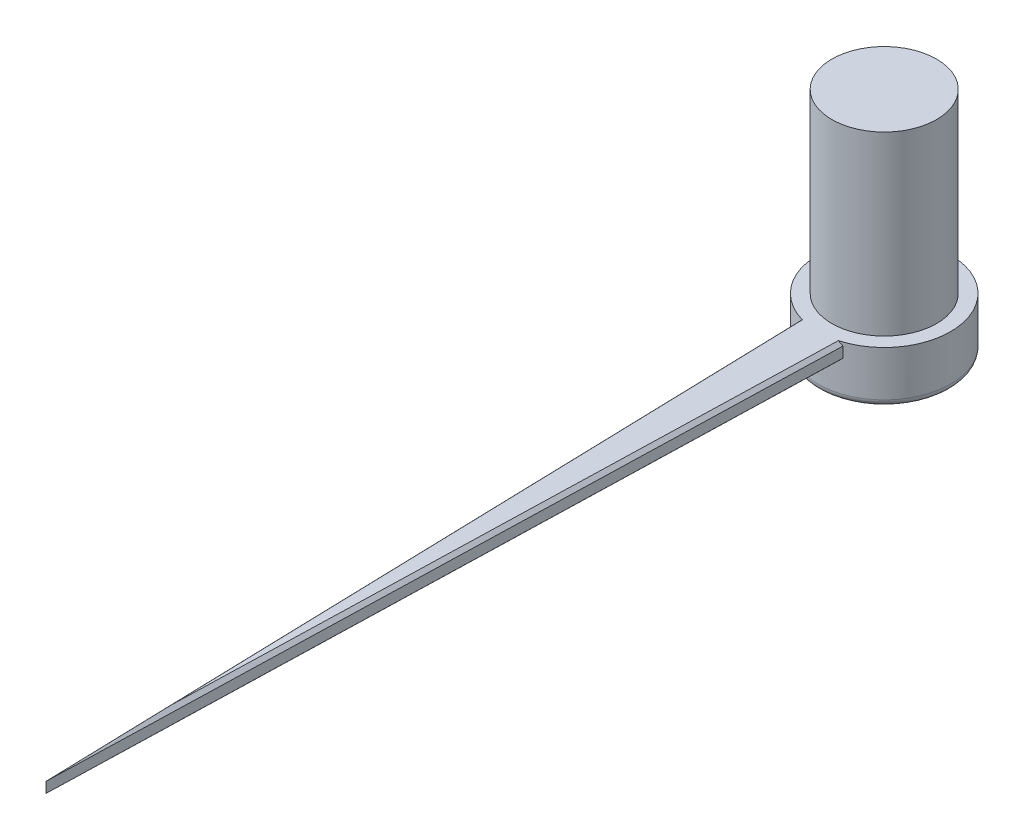
ISO-10303-21;
HEADER;
FILE_DESCRIPTION(('STEP AP214'),'2;1');
FILE_NAME('part.step','',(''),(''),'','','');
FILE_SCHEMA(('AUTOMOTIVE_DESIGN { 1 0 10303 214 1 1 1 1 }'));
ENDSEC;
DATA;
#1=APPLICATION_CONTEXT('core data for automotive mechanical design processes');
#2=APPLICATION_PROTOCOL_DEFINITION('international standard','automotive_design',2000,#1);
#3=PRODUCT_CONTEXT('',#1,'mechanical');
#4=PRODUCT('Part','Part','',(#3));
#5=PRODUCT_RELATED_PRODUCT_CATEGORY('part','',(#4));
#6=PRODUCT_DEFINITION_FORMATION('','',#4);
#7=PRODUCT_DEFINITION_CONTEXT('part definition',#1,'design');
#8=PRODUCT_DEFINITION('design','',#6,#7);
#9=PRODUCT_DEFINITION_SHAPE('','',#8);
#10=(LENGTH_UNIT() NAMED_UNIT(*) SI_UNIT(.MILLI.,.METRE.));
#11=(NAMED_UNIT(*) PLANE_ANGLE_UNIT() SI_UNIT($,.RADIAN.));
#12=(NAMED_UNIT(*) SI_UNIT($,.STERADIAN.) SOLID_ANGLE_UNIT());
#13=UNCERTAINTY_MEASURE_WITH_UNIT(LENGTH_MEASURE(1.E-05),#10,'distance_accuracy_value','');
#14=(GEOMETRIC_REPRESENTATION_CONTEXT(3) GLOBAL_UNCERTAINTY_ASSIGNED_CONTEXT((#13)) GLOBAL_UNIT_ASSIGNED_CONTEXT((#10,
#11,#12)) REPRESENTATION_CONTEXT('',''));
#15=CARTESIAN_POINT('',(0.,0.,0.));
#16=DIRECTION('',(0.,0.,1.));
#17=DIRECTION('',(1.,0.,0.));
#18=AXIS2_PLACEMENT_3D('',#15,#16,#17);
#19=CARTESIAN_POINT('',(0.,0.2,0.));
#20=DIRECTION('',(0.,-1.,0.));
#21=DIRECTION('',(0.,0.,-1.));
#22=AXIS2_PLACEMENT_3D('',#19,#20,#21);
#23=TOROIDAL_SURFACE('',#22,1.7,0.2);
#24=CARTESIAN_POINT('',(0.,0.,0.));
#25=DIRECTION('',(0.,-1.,0.));
#26=DIRECTION('',(0.,0.,-1.));
#27=AXIS2_PLACEMENT_3D('',#24,#25,#26);
#28=CIRCLE('',#27,1.7);
#29=CARTESIAN_POINT('',(0.,0.,-1.7));
#30=VERTEX_POINT('',#29);
#31=EDGE_CURVE('E122',#30,#30,#28,.T.);
#32=ORIENTED_EDGE('',*,*,#31,.F.);
#33=EDGE_LOOP('',(#32));
#34=FACE_BOUND('',#33,.T.);
#35=CARTESIAN_POINT('',(0.,0.2,0.));
#36=DIRECTION('',(0.,1.,0.));
#37=DIRECTION('',(0.,0.,-1.));
#38=AXIS2_PLACEMENT_3D('',#35,#36,#37);
#39=CIRCLE('',#38,1.9);
#40=CARTESIAN_POINT('',(0.,0.2,-1.9));
#41=VERTEX_POINT('',#40);
#42=EDGE_CURVE('E106',#41,#41,#39,.T.);
#43=ORIENTED_EDGE('',*,*,#42,.F.);
#44=EDGE_LOOP('',(#43));
#45=FACE_BOUND('',#44,.T.);
#46=ADVANCED_FACE('F16',(#34,#45),#23,.T.);
#47=CARTESIAN_POINT('',(-0.259483430718075,1.,11.0572078730755));
#48=DIRECTION('',(0.7068341354154,0.707106781186547,-0.0196342815393167));
#49=DIRECTION('',(-0.0277670672403533,0.,-0.999614420652718));
#50=AXIS2_PLACEMENT_3D('',#47,#48,#49);
#51=PLANE('',#50);
#52=DIRECTION('',(0.,0.0277563690826685,0.999614717766474));
#53=VECTOR('',#52,1.);
#54=CARTESIAN_POINT('',(0.,0.740816453845688,11.0644046400292));
#55=LINE('',#54,#53);
#56=CARTESIAN_POINT('',(0.,1.,20.3986113789262));
#57=VERTEX_POINT('',#56);
#58=CARTESIAN_POINT('',(0.,1.1,24.));
#59=VERTEX_POINT('',#58);
#60=EDGE_CURVE('E11',#57,#59,#55,.T.);
#61=ORIENTED_EDGE('',*,*,#60,.T.);
#62=DIRECTION('',(0.0277670672403533,0.,0.999614420652718));
#63=VECTOR('',#62,1.);
#64=CARTESIAN_POINT('',(-0.3125,1.1,12.75));
#65=LINE('',#64,#63);
#66=CARTESIAN_POINT('',(-0.616746797326608,1.1,1.79711529624211));
#67=VERTEX_POINT('',#66);
#68=EDGE_CURVE('E110',#67,#59,#65,.T.);
#69=ORIENTED_EDGE('',*,*,#68,.F.);
#70=CARTESIAN_POINT('',(0.,0.433590386231521,0.));
#71=DIRECTION('',(-0.7068341354154,-0.707106781186547,0.0196342815393167));
#72=DIRECTION('',(0.706834135415399,-0.707106781186548,-0.0196342815393167));
#73=AXIS2_PLACEMENT_3D('',#70,#71,#72);
#74=ELLIPSE('',#73,2.68700576850888,1.9);
#75=CARTESIAN_POINT('',(-0.515832595389574,1.,1.82863794490152));
#76=VERTEX_POINT('',#75);
#77=EDGE_CURVE('E111',#76,#67,#74,.T.);
#78=ORIENTED_EDGE('',*,*,#77,.F.);
#79=DIRECTION('',(-0.0277670672403533,0.,-0.999614420652718));
#80=VECTOR('',#79,1.);
#81=CARTESIAN_POINT('',(-0.259483430718074,1.,11.0572078730755));
#82=LINE('',#81,#80);
#83=EDGE_CURVE('E121',#57,#76,#82,.T.);
#84=ORIENTED_EDGE('',*,*,#83,.F.);
#85=EDGE_LOOP('',(#61,#69,#78,#84));
#86=FACE_BOUND('',#85,.T.);
#87=ADVANCED_FACE('F216',(#86),#51,.F.);
#88=CARTESIAN_POINT('',(0.259483430718074,1.,11.0572078730755));
#89=DIRECTION('',(-0.7068341354154,0.707106781186547,-0.0196342815393167));
#90=DIRECTION('',(-0.0277670672403533,0.,0.999614420652718));
#91=AXIS2_PLACEMENT_3D('',#88,#89,#90);
#92=PLANE('',#91);
#93=CARTESIAN_POINT('',(0.,0.433590386231521,0.));
#94=DIRECTION('',(0.7068341354154,-0.707106781186547,0.0196342815393167));
#95=DIRECTION('',(-0.706834135415399,-0.707106781186548,-0.0196342815393167));
#96=AXIS2_PLACEMENT_3D('',#93,#94,#95);
#97=ELLIPSE('',#96,2.68700576850888,1.9);
#98=CARTESIAN_POINT('',(0.616746797326608,1.1,1.79711529624211));
#99=VERTEX_POINT('',#98);
#100=CARTESIAN_POINT('',(0.515832595389574,1.,1.82863794490152));
#101=VERTEX_POINT('',#100);
#102=EDGE_CURVE('E20',#99,#101,#97,.T.);
#103=ORIENTED_EDGE('',*,*,#102,.F.);
#104=DIRECTION('',(0.0277670672403533,0.,-0.999614420652718));
#105=VECTOR('',#104,1.);
#106=CARTESIAN_POINT('',(0.3125,1.1,12.75));
#107=LINE('',#106,#105);
#108=EDGE_CURVE('E89',#59,#99,#107,.T.);
#109=ORIENTED_EDGE('',*,*,#108,.F.);
#110=ORIENTED_EDGE('',*,*,#60,.F.);
#111=DIRECTION('',(-0.0277670672403533,0.,0.999614420652718));
#112=VECTOR('',#111,1.);
#113=CARTESIAN_POINT('',(0.259483430718074,1.,11.0572078730755));
#114=LINE('',#113,#112);
#115=EDGE_CURVE('E117',#101,#57,#114,.T.);
#116=ORIENTED_EDGE('',*,*,#115,.F.);
#117=EDGE_LOOP('',(#103,#109,#110,#116));
#118=FACE_BOUND('',#117,.T.);
#119=ADVANCED_FACE('F222',(#118),#92,.F.);
#120=CARTESIAN_POINT('',(-0.3125,1.4,12.75));
#121=DIRECTION('',(-0.7068341354154,0.707106781186547,0.0196342815393167));
#122=DIRECTION('',(0.0277670672403533,0.,0.999614420652718));
#123=AXIS2_PLACEMENT_3D('',#120,#121,#122);
#124=PLANE('',#123);
#125=DIRECTION('',(0.,0.0277563690826684,-0.999614717766474));
#126=VECTOR('',#125,1.);
#127=CARTESIAN_POINT('',(0.,1.71213884427643,12.7586671802773));
#128=LINE('',#127,#126);
#129=CARTESIAN_POINT('',(0.,1.4,24.));
#130=VERTEX_POINT('',#129);
#131=CARTESIAN_POINT('',(0.,1.5,20.3986113789262));
#132=VERTEX_POINT('',#131);
#133=EDGE_CURVE('E27',#130,#132,#128,.T.);
#134=ORIENTED_EDGE('',*,*,#133,.T.);
#135=DIRECTION('',(0.0277670672403533,0.,0.999614420652718));
#136=VECTOR('',#135,1.);
#137=CARTESIAN_POINT('',(0.0999614420652719,1.5,23.997223293276));
#138=LINE('',#137,#136);
#139=CARTESIAN_POINT('',(-0.515832595389574,1.5,1.82863794490152));
#140=VERTEX_POINT('',#139);
#141=EDGE_CURVE('E131',#140,#132,#138,.T.);
#142=ORIENTED_EDGE('',*,*,#141,.F.);
#143=CARTESIAN_POINT('',(0.,2.06640961376848,0.));
#144=DIRECTION('',(-0.7068341354154,0.707106781186547,0.0196342815393167));
#145=DIRECTION('',(-0.706834135415399,-0.707106781186548,0.0196342815393167));
#146=AXIS2_PLACEMENT_3D('',#143,#144,#145);
#147=ELLIPSE('',#146,2.68700576850888,1.9);
#148=CARTESIAN_POINT('',(-0.616746797326608,1.4,1.79711529624211));
#149=VERTEX_POINT('',#148);
#150=EDGE_CURVE('E127',#149,#140,#147,.T.);
#151=ORIENTED_EDGE('',*,*,#150,.F.);
#152=DIRECTION('',(-0.0277670672403533,0.,-0.999614420652718));
#153=VECTOR('',#152,1.);
#154=CARTESIAN_POINT('',(-0.616746797326608,1.4,1.79711529624211));
#155=LINE('',#154,#153);
#156=EDGE_CURVE('E143',#130,#149,#155,.T.);
#157=ORIENTED_EDGE('',*,*,#156,.F.);
#158=EDGE_LOOP('',(#134,#142,#151,#157));
#159=FACE_BOUND('',#158,.T.);
#160=ADVANCED_FACE('F198',(#159),#124,.T.);
#161=CARTESIAN_POINT('',(0.3125,1.4,12.75));
#162=DIRECTION('',(0.706834135415399,0.707106781186548,0.0196342815393167));
#163=DIRECTION('',(0.0277670672403533,0.,-0.999614420652718));
#164=AXIS2_PLACEMENT_3D('',#161,#162,#163);
#165=PLANE('',#164);
#166=CARTESIAN_POINT('',(0.,2.06640961376848,0.));
#167=DIRECTION('',(0.7068341354154,0.707106781186547,0.0196342815393167));
#168=DIRECTION('',(0.706834135415399,-0.707106781186548,0.0196342815393167));
#169=AXIS2_PLACEMENT_3D('',#166,#167,#168);
#170=ELLIPSE('',#169,2.68700576850888,1.9);
#171=CARTESIAN_POINT('',(0.515832595389574,1.5,1.82863794490152));
#172=VERTEX_POINT('',#171);
#173=CARTESIAN_POINT('',(0.616746797326608,1.4,1.79711529624211));
#174=VERTEX_POINT('',#173);
#175=EDGE_CURVE('E76',#172,#174,#170,.T.);
#176=ORIENTED_EDGE('',*,*,#175,.F.);
#177=DIRECTION('',(0.0277670672403533,0.,-0.999614420652718));
#178=VECTOR('',#177,1.);
#179=CARTESIAN_POINT('',(0.516785355261336,1.5,1.79433858951807));
#180=LINE('',#179,#178);
#181=EDGE_CURVE('E84',#132,#172,#180,.T.);
#182=ORIENTED_EDGE('',*,*,#181,.F.);
#183=ORIENTED_EDGE('',*,*,#133,.F.);
#184=DIRECTION('',(-0.0277670672403533,0.,0.999614420652718));
#185=VECTOR('',#184,1.);
#186=CARTESIAN_POINT('',(0.,1.4,24.));
#187=LINE('',#186,#185);
#188=EDGE_CURVE('E71',#174,#130,#187,.T.);
#189=ORIENTED_EDGE('',*,*,#188,.F.);
#190=EDGE_LOOP('',(#176,#182,#183,#189));
#191=FACE_BOUND('',#190,.T.);
#192=ADVANCED_FACE('F73',(#191),#165,.T.);
#193=CARTESIAN_POINT('',(0.,1.,11.05));
#194=DIRECTION('',(0.,1.,0.));
#195=DIRECTION('',(1.,0.,0.));
#196=AXIS2_PLACEMENT_3D('',#193,#194,#195);
#197=PLANE('',#196);
#198=ORIENTED_EDGE('',*,*,#115,.T.);
#199=ORIENTED_EDGE('',*,*,#83,.T.);
#200=CARTESIAN_POINT('',(0.,1.,0.));
#201=DIRECTION('',(0.,-1.,0.));
#202=DIRECTION('',(0.,0.,1.));
#203=AXIS2_PLACEMENT_3D('',#200,#201,#202);
#204=CIRCLE('',#203,1.9);
#205=EDGE_CURVE('E116',#101,#76,#204,.T.);
#206=ORIENTED_EDGE('',*,*,#205,.F.);
#207=EDGE_LOOP('',(#198,#199,#206));
#208=FACE_BOUND('',#207,.T.);
#209=ADVANCED_FACE('F229',(#208),#197,.F.);
#210=CARTESIAN_POINT('',(-0.3125,1.,12.75));
#211=DIRECTION('',(0.999614420652718,0.,-0.0277670672403533));
#212=DIRECTION('',(0.,-1.,0.));
#213=AXIS2_PLACEMENT_3D('',#210,#211,#212);
#214=PLANE('',#213);
#215=DIRECTION('',(0.,1.,0.));
#216=VECTOR('',#215,1.);
#217=CARTESIAN_POINT('',(0.,1.,24.));
#218=LINE('',#217,#216);
#219=EDGE_CURVE('E83',#59,#130,#218,.T.);
#220=ORIENTED_EDGE('',*,*,#219,.T.);
#221=ORIENTED_EDGE('',*,*,#156,.T.);
#222=DIRECTION('',(0.,1.,0.));
#223=VECTOR('',#222,1.);
#224=CARTESIAN_POINT('',(-0.616746797326608,3.27984818703368,1.79711529624211));
#225=LINE('',#224,#223);
#226=EDGE_CURVE('E115',#67,#149,#225,.T.);
#227=ORIENTED_EDGE('',*,*,#226,.F.);
#228=ORIENTED_EDGE('',*,*,#68,.T.);
#229=EDGE_LOOP('',(#220,#221,#227,#228));
#230=FACE_BOUND('',#229,.T.);
#231=ADVANCED_FACE('F171',(#230),#214,.F.);
#232=CARTESIAN_POINT('',(0.3125,1.,12.75));
#233=DIRECTION('',(-0.999614420652718,0.,-0.0277670672403533));
#234=DIRECTION('',(-0.0277670672403533,0.,0.999614420652718));
#235=AXIS2_PLACEMENT_3D('',#232,#233,#234);
#236=PLANE('',#235);
#237=DIRECTION('',(0.,-1.,0.));
#238=VECTOR('',#237,1.);
#239=CARTESIAN_POINT('',(0.616746797326608,3.27984818703368,1.79711529624211));
#240=LINE('',#239,#238);
#241=EDGE_CURVE('E87',#174,#99,#240,.T.);
#242=ORIENTED_EDGE('',*,*,#241,.F.);
#243=ORIENTED_EDGE('',*,*,#188,.T.);
#244=ORIENTED_EDGE('',*,*,#219,.F.);
#245=ORIENTED_EDGE('',*,*,#108,.T.);
#246=EDGE_LOOP('',(#242,#243,#244,#245));
#247=FACE_BOUND('',#246,.T.);
#248=ADVANCED_FACE('F88',(#247),#236,.F.);
#249=CARTESIAN_POINT('',(0.,1.5,1.7));
#250=DIRECTION('',(0.,1.,0.));
#251=DIRECTION('',(1.,0.,0.));
#252=AXIS2_PLACEMENT_3D('',#249,#250,#251);
#253=PLANE('',#252);
#254=CARTESIAN_POINT('',(0.,1.5,0.));
#255=DIRECTION('',(0.,-1.,0.));
#256=DIRECTION('',(0.,0.,-1.));
#257=AXIS2_PLACEMENT_3D('',#254,#255,#256);
#258=CIRCLE('',#257,1.5);
#259=CARTESIAN_POINT('',(0.,1.5,-1.5));
#260=VERTEX_POINT('',#259);
#261=EDGE_CURVE('E128',#260,#260,#258,.T.);
#262=ORIENTED_EDGE('',*,*,#261,.T.);
#263=EDGE_LOOP('',(#262));
#264=FACE_BOUND('',#263,.T.);
#265=CARTESIAN_POINT('',(0.,1.5,0.));
#266=DIRECTION('',(0.,-1.,0.));
#267=DIRECTION('',(0.,0.,-1.));
#268=AXIS2_PLACEMENT_3D('',#265,#266,#267);
#269=CIRCLE('',#268,1.9);
#270=EDGE_CURVE('E99',#140,#172,#269,.T.);
#271=ORIENTED_EDGE('',*,*,#270,.F.);
#272=ORIENTED_EDGE('',*,*,#141,.T.);
#273=ORIENTED_EDGE('',*,*,#181,.T.);
#274=EDGE_LOOP('',(#271,#272,#273));
#275=FACE_BOUND('',#274,.T.);
#276=ADVANCED_FACE('F200',(#264,#275),#253,.T.);
#277=CARTESIAN_POINT('',(0.,3.27984818703368,0.));
#278=DIRECTION('',(0.,-1.,0.));
#279=DIRECTION('',(0.,0.,-1.));
#280=AXIS2_PLACEMENT_3D('',#277,#278,#279);
#281=CYLINDRICAL_SURFACE('',#280,1.5);
#282=ORIENTED_EDGE('',*,*,#261,.F.);
#283=EDGE_LOOP('',(#282));
#284=FACE_BOUND('',#283,.T.);
#285=CARTESIAN_POINT('',(0.,6.55969637406736,0.));
#286=DIRECTION('',(0.,-1.,0.));
#287=DIRECTION('',(0.,0.,-1.));
#288=AXIS2_PLACEMENT_3D('',#285,#286,#287);
#289=CIRCLE('',#288,1.5);
#290=CARTESIAN_POINT('',(0.,6.55969637406736,-1.5));
#291=VERTEX_POINT('',#290);
#292=EDGE_CURVE('E126',#291,#291,#289,.T.);
#293=ORIENTED_EDGE('',*,*,#292,.T.);
#294=EDGE_LOOP('',(#293));
#295=FACE_BOUND('',#294,.T.);
#296=ADVANCED_FACE('F202',(#284,#295),#281,.T.);
#297=CARTESIAN_POINT('',(0.,6.55969637406736,0.75));
#298=DIRECTION('',(0.,-1.,0.));
#299=DIRECTION('',(0.,0.,-1.));
#300=AXIS2_PLACEMENT_3D('',#297,#298,#299);
#301=PLANE('',#300);
#302=ORIENTED_EDGE('',*,*,#292,.F.);
#303=EDGE_LOOP('',(#302));
#304=FACE_BOUND('',#303,.T.);
#305=ADVANCED_FACE('F18',(#304),#301,.F.);
#306=CARTESIAN_POINT('',(0.,0.,0.95));
#307=DIRECTION('',(0.,-1.,0.));
#308=DIRECTION('',(0.,0.,-1.));
#309=AXIS2_PLACEMENT_3D('',#306,#307,#308);
#310=PLANE('',#309);
#311=ORIENTED_EDGE('',*,*,#31,.T.);
#312=EDGE_LOOP('',(#311));
#313=FACE_BOUND('',#312,.T.);
#314=ADVANCED_FACE('F231',(#313),#310,.T.);
#315=CARTESIAN_POINT('',(0.,3.27984818703368,0.));
#316=DIRECTION('',(0.,-1.,0.));
#317=DIRECTION('',(0.,0.,-1.));
#318=AXIS2_PLACEMENT_3D('',#315,#316,#317);
#319=CYLINDRICAL_SURFACE('',#318,1.9);
#320=ORIENTED_EDGE('',*,*,#270,.T.);
#321=ORIENTED_EDGE('',*,*,#175,.T.);
#322=ORIENTED_EDGE('',*,*,#241,.T.);
#323=ORIENTED_EDGE('',*,*,#102,.T.);
#324=ORIENTED_EDGE('',*,*,#205,.T.);
#325=ORIENTED_EDGE('',*,*,#77,.T.);
#326=ORIENTED_EDGE('',*,*,#226,.T.);
#327=ORIENTED_EDGE('',*,*,#150,.T.);
#328=EDGE_LOOP('',(#320,#321,#322,#323,#324,#325,#326,#327));
#329=FACE_BOUND('',#328,.T.);
#330=ORIENTED_EDGE('',*,*,#42,.T.);
#331=EDGE_LOOP('',(#330));
#332=FACE_BOUND('',#331,.T.);
#333=ADVANCED_FACE('F95',(#329,#332),#319,.T.);
#334=CLOSED_SHELL('',(#46,#87,#119,#160,#192,#209,#231,#248,#276,#296,#305,#314,#333));
#335=MANIFOLD_SOLID_BREP('B1',#334);
#336=ADVANCED_BREP_SHAPE_REPRESENTATION('',(#18,#335),#14);
#337=SHAPE_DEFINITION_REPRESENTATION(#9,#336);
ENDSEC;
END-ISO-10303-21;
